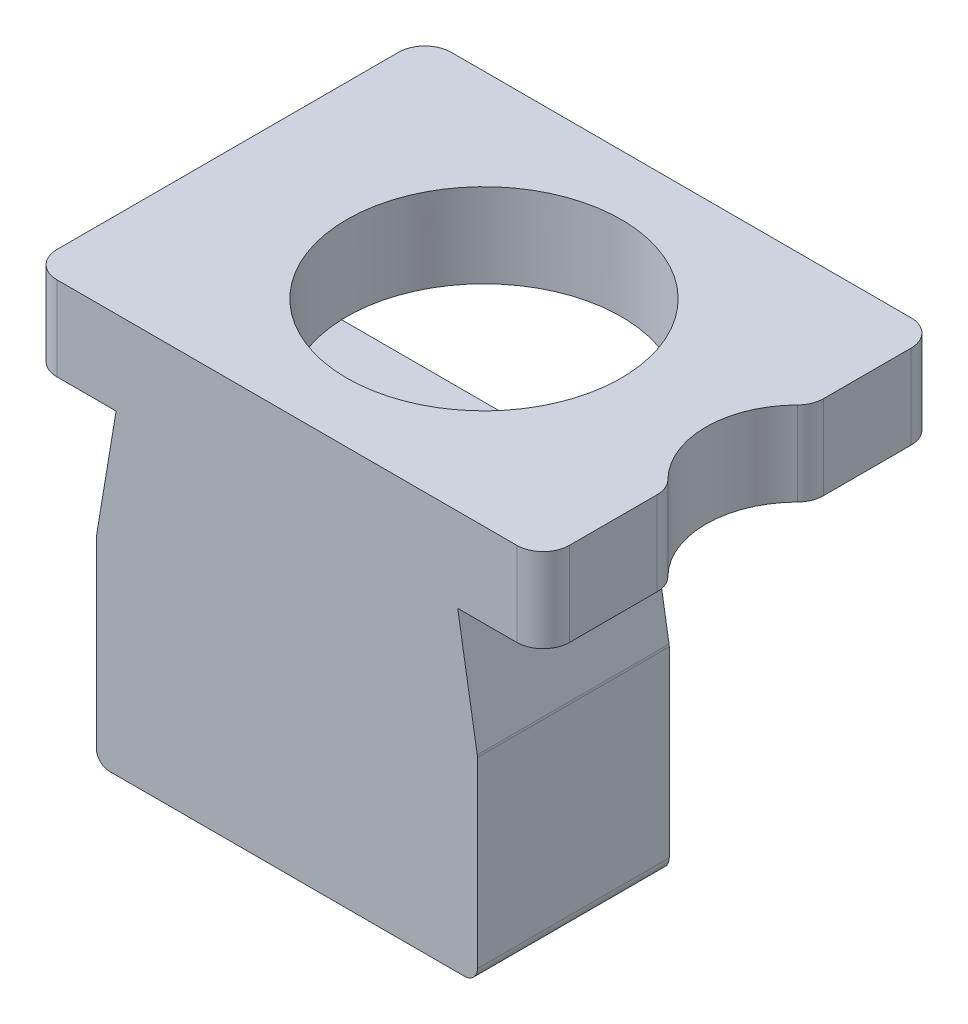
ISO-10303-21;
HEADER;
FILE_DESCRIPTION(('STEP AP214'),'2;1');
FILE_NAME('part.step','',(''),(''),'','','');
FILE_SCHEMA(('AUTOMOTIVE_DESIGN { 1 0 10303 214 1 1 1 1 }'));
ENDSEC;
DATA;
#1=APPLICATION_CONTEXT('core data for automotive mechanical design processes');
#2=APPLICATION_PROTOCOL_DEFINITION('international standard','automotive_design',2000,#1);
#3=PRODUCT_CONTEXT('',#1,'mechanical');
#4=PRODUCT('Part','Part','',(#3));
#5=PRODUCT_RELATED_PRODUCT_CATEGORY('part','',(#4));
#6=PRODUCT_DEFINITION_FORMATION('','',#4);
#7=PRODUCT_DEFINITION_CONTEXT('part definition',#1,'design');
#8=PRODUCT_DEFINITION('design','',#6,#7);
#9=PRODUCT_DEFINITION_SHAPE('','',#8);
#10=(LENGTH_UNIT() NAMED_UNIT(*) SI_UNIT(.MILLI.,.METRE.));
#11=(NAMED_UNIT(*) PLANE_ANGLE_UNIT() SI_UNIT($,.RADIAN.));
#12=(NAMED_UNIT(*) SI_UNIT($,.STERADIAN.) SOLID_ANGLE_UNIT());
#13=UNCERTAINTY_MEASURE_WITH_UNIT(LENGTH_MEASURE(1.E-05),#10,'distance_accuracy_value','');
#14=(GEOMETRIC_REPRESENTATION_CONTEXT(3) GLOBAL_UNCERTAINTY_ASSIGNED_CONTEXT((#13)) GLOBAL_UNIT_ASSIGNED_CONTEXT((#10,
#11,#12)) REPRESENTATION_CONTEXT('',''));
#15=CARTESIAN_POINT('',(0.,0.,0.));
#16=DIRECTION('',(0.,0.,1.));
#17=DIRECTION('',(1.,0.,0.));
#18=AXIS2_PLACEMENT_3D('',#15,#16,#17);
#19=CARTESIAN_POINT('',(19.5,6.4,15.));
#20=DIRECTION('',(-1.,0.,0.));
#21=DIRECTION('',(0.,0.,1.));
#22=AXIS2_PLACEMENT_3D('',#19,#20,#21);
#23=PLANE('',#22);
#24=DIRECTION('',(0.,0.,-1.));
#25=VECTOR('',#24,1.);
#26=CARTESIAN_POINT('',(19.5,0.,15.));
#27=LINE('',#26,#25);
#28=CARTESIAN_POINT('',(19.5,0.,13.));
#29=VERTEX_POINT('',#28);
#30=CARTESIAN_POINT('',(19.5,0.,6.33489795153023));
#31=VERTEX_POINT('',#30);
#32=EDGE_CURVE('E273',#29,#31,#27,.T.);
#33=ORIENTED_EDGE('',*,*,#32,.T.);
#34=DIRECTION('',(0.,1.,0.));
#35=VECTOR('',#34,1.);
#36=CARTESIAN_POINT('',(19.5,6.4,6.33489795153023));
#37=LINE('',#36,#35);
#38=CARTESIAN_POINT('',(19.5,6.4,6.33489795153023));
#39=VERTEX_POINT('',#38);
#40=EDGE_CURVE('E234',#31,#39,#37,.T.);
#41=ORIENTED_EDGE('',*,*,#40,.T.);
#42=DIRECTION('',(0.,0.,-1.));
#43=VECTOR('',#42,1.);
#44=CARTESIAN_POINT('',(19.5,6.4,15.));
#45=LINE('',#44,#43);
#46=CARTESIAN_POINT('',(19.5,6.4,13.));
#47=VERTEX_POINT('',#46);
#48=EDGE_CURVE('E264',#47,#39,#45,.T.);
#49=ORIENTED_EDGE('',*,*,#48,.F.);
#50=DIRECTION('',(0.,-1.,0.));
#51=VECTOR('',#50,1.);
#52=CARTESIAN_POINT('',(19.5,6.4,13.));
#53=LINE('',#52,#51);
#54=EDGE_CURVE('E229',#47,#29,#53,.T.);
#55=ORIENTED_EDGE('',*,*,#54,.T.);
#56=EDGE_LOOP('',(#33,#41,#49,#55));
#57=FACE_BOUND('',#56,.T.);
#58=ADVANCED_FACE('F43',(#57),#23,.F.);
#59=CARTESIAN_POINT('',(0.,6.4,0.));
#60=DIRECTION('',(0.,-1.,0.));
#61=DIRECTION('',(0.,0.,-1.));
#62=AXIS2_PLACEMENT_3D('',#59,#60,#61);
#63=PLANE('',#62);
#64=ORIENTED_EDGE('',*,*,#48,.T.);
#65=CARTESIAN_POINT('',(17.5,6.4,6.33489795153023));
#66=DIRECTION('',(0.,-1.,0.));
#67=DIRECTION('',(0.,0.,-1.));
#68=AXIS2_PLACEMENT_3D('',#65,#66,#67);
#69=CIRCLE('',#68,2.);
#70=CARTESIAN_POINT('',(18.9206426635388,6.4,4.92714285119018));
#71=VERTEX_POINT('',#70);
#72=EDGE_CURVE('E294',#39,#71,#69,.F.);
#73=ORIENTED_EDGE('',*,*,#72,.T.);
#74=CARTESIAN_POINT('',(23.8928919859245,6.4,0.));
#75=DIRECTION('',(0.,1.,0.));
#76=DIRECTION('',(0.,0.,1.));
#77=AXIS2_PLACEMENT_3D('',#74,#75,#76);
#78=CIRCLE('',#77,7.);
#79=CARTESIAN_POINT('',(18.9206426635388,6.4,-4.92714285119018));
#80=VERTEX_POINT('',#79);
#81=EDGE_CURVE('E436',#80,#71,#78,.T.);
#82=ORIENTED_EDGE('',*,*,#81,.F.);
#83=CARTESIAN_POINT('',(17.5,6.4,-6.33489795153023));
#84=DIRECTION('',(0.,-1.,0.));
#85=DIRECTION('',(0.,0.,-1.));
#86=AXIS2_PLACEMENT_3D('',#83,#84,#85);
#87=CIRCLE('',#86,2.);
#88=CARTESIAN_POINT('',(19.5,6.4,-6.33489795153022));
#89=VERTEX_POINT('',#88);
#90=EDGE_CURVE('E292',#80,#89,#87,.F.);
#91=ORIENTED_EDGE('',*,*,#90,.T.);
#92=CARTESIAN_POINT('',(19.5,6.4,-13.));
#93=VERTEX_POINT('',#92);
#94=EDGE_CURVE('E261',#89,#93,#45,.T.);
#95=ORIENTED_EDGE('',*,*,#94,.T.);
#96=CARTESIAN_POINT('',(17.5,6.4,-13.));
#97=DIRECTION('',(0.,-1.,0.));
#98=DIRECTION('',(0.,0.,-1.));
#99=AXIS2_PLACEMENT_3D('',#96,#97,#98);
#100=CIRCLE('',#99,2.);
#101=CARTESIAN_POINT('',(17.5,6.4,-15.));
#102=VERTEX_POINT('',#101);
#103=EDGE_CURVE('E284',#93,#102,#100,.F.);
#104=ORIENTED_EDGE('',*,*,#103,.T.);
#105=DIRECTION('',(-1.,0.,0.));
#106=VECTOR('',#105,1.);
#107=CARTESIAN_POINT('',(-19.5,6.4,-15.));
#108=LINE('',#107,#106);
#109=CARTESIAN_POINT('',(-17.5,6.4,-15.));
#110=VERTEX_POINT('',#109);
#111=EDGE_CURVE('E266',#102,#110,#108,.T.);
#112=ORIENTED_EDGE('',*,*,#111,.T.);
#113=CARTESIAN_POINT('',(-17.5,6.4,-13.));
#114=DIRECTION('',(0.,-1.,0.));
#115=DIRECTION('',(0.,0.,-1.));
#116=AXIS2_PLACEMENT_3D('',#113,#114,#115);
#117=CIRCLE('',#116,2.);
#118=CARTESIAN_POINT('',(-19.5,6.4,-13.));
#119=VERTEX_POINT('',#118);
#120=EDGE_CURVE('E290',#110,#119,#117,.F.);
#121=ORIENTED_EDGE('',*,*,#120,.T.);
#122=DIRECTION('',(0.,0.,1.));
#123=VECTOR('',#122,1.);
#124=CARTESIAN_POINT('',(-19.5,6.4,15.));
#125=LINE('',#124,#123);
#126=CARTESIAN_POINT('',(-19.5,6.4,13.));
#127=VERTEX_POINT('',#126);
#128=EDGE_CURVE('E237',#119,#127,#125,.T.);
#129=ORIENTED_EDGE('',*,*,#128,.T.);
#130=CARTESIAN_POINT('',(-17.5,6.4,13.));
#131=DIRECTION('',(0.,-1.,0.));
#132=DIRECTION('',(0.,0.,-1.));
#133=AXIS2_PLACEMENT_3D('',#130,#131,#132);
#134=CIRCLE('',#133,2.);
#135=CARTESIAN_POINT('',(-17.5,6.4,15.));
#136=VERTEX_POINT('',#135);
#137=EDGE_CURVE('E288',#127,#136,#134,.F.);
#138=ORIENTED_EDGE('',*,*,#137,.T.);
#139=DIRECTION('',(1.,0.,0.));
#140=VECTOR('',#139,1.);
#141=CARTESIAN_POINT('',(-19.5,6.4,15.));
#142=LINE('',#141,#140);
#143=CARTESIAN_POINT('',(17.5,6.4,15.));
#144=VERTEX_POINT('',#143);
#145=EDGE_CURVE('E230',#136,#144,#142,.T.);
#146=ORIENTED_EDGE('',*,*,#145,.T.);
#147=CARTESIAN_POINT('',(17.5,6.4,13.));
#148=DIRECTION('',(0.,-1.,0.));
#149=DIRECTION('',(0.,0.,-1.));
#150=AXIS2_PLACEMENT_3D('',#147,#148,#149);
#151=CIRCLE('',#150,2.);
#152=EDGE_CURVE('E286',#144,#47,#151,.F.);
#153=ORIENTED_EDGE('',*,*,#152,.T.);
#154=EDGE_LOOP('',(#64,#73,#82,#91,#95,#104,#112,#121,#129,#138,#146,#153));
#155=FACE_BOUND('',#154,.T.);
#156=CARTESIAN_POINT('',(0.,6.4,0.));
#157=DIRECTION('',(0.,1.,0.));
#158=DIRECTION('',(0.,0.,1.));
#159=AXIS2_PLACEMENT_3D('',#156,#157,#158);
#160=CIRCLE('',#159,10.45);
#161=CARTESIAN_POINT('',(0.,6.4,10.45));
#162=VERTEX_POINT('',#161);
#163=EDGE_CURVE('E256',#162,#162,#160,.T.);
#164=ORIENTED_EDGE('',*,*,#163,.F.);
#165=EDGE_LOOP('',(#164));
#166=FACE_BOUND('',#165,.T.);
#167=ADVANCED_FACE('F397',(#155,#166),#63,.F.);
#168=CARTESIAN_POINT('',(0.,0.,0.));
#169=DIRECTION('',(0.,-1.,0.));
#170=DIRECTION('',(0.,0.,-1.));
#171=AXIS2_PLACEMENT_3D('',#168,#169,#170);
#172=PLANE('',#171);
#173=CARTESIAN_POINT('',(23.8928919859245,0.,0.));
#174=DIRECTION('',(0.,-1.,0.));
#175=DIRECTION('',(0.,0.,-1.));
#176=AXIS2_PLACEMENT_3D('',#173,#174,#175);
#177=CIRCLE('',#176,7.);
#178=CARTESIAN_POINT('',(18.9206426635388,0.,-4.92714285119018));
#179=VERTEX_POINT('',#178);
#180=CARTESIAN_POINT('',(18.9206426635388,0.,4.92714285119018));
#181=VERTEX_POINT('',#180);
#182=EDGE_CURVE('E372',#179,#181,#177,.F.);
#183=ORIENTED_EDGE('',*,*,#182,.T.);
#184=CARTESIAN_POINT('',(17.5,0.,6.33489795153023));
#185=DIRECTION('',(0.,-1.,0.));
#186=DIRECTION('',(0.,0.,-1.));
#187=AXIS2_PLACEMENT_3D('',#184,#185,#186);
#188=CIRCLE('',#187,2.);
#189=EDGE_CURVE('E311',#181,#31,#188,.T.);
#190=ORIENTED_EDGE('',*,*,#189,.T.);
#191=ORIENTED_EDGE('',*,*,#32,.F.);
#192=CARTESIAN_POINT('',(17.5,0.,13.));
#193=DIRECTION('',(0.,-1.,0.));
#194=DIRECTION('',(0.,0.,-1.));
#195=AXIS2_PLACEMENT_3D('',#192,#193,#194);
#196=CIRCLE('',#195,2.);
#197=CARTESIAN_POINT('',(17.5,0.,15.));
#198=VERTEX_POINT('',#197);
#199=EDGE_CURVE('E303',#29,#198,#196,.T.);
#200=ORIENTED_EDGE('',*,*,#199,.T.);
#201=DIRECTION('',(1.,0.,0.));
#202=VECTOR('',#201,1.);
#203=CARTESIAN_POINT('',(-19.5,0.,15.));
#204=LINE('',#203,#202);
#205=CARTESIAN_POINT('',(13.,0.,15.));
#206=VERTEX_POINT('',#205);
#207=EDGE_CURVE('E280',#206,#198,#204,.T.);
#208=ORIENTED_EDGE('',*,*,#207,.F.);
#209=DIRECTION('',(0.,0.,1.));
#210=VECTOR('',#209,1.);
#211=CARTESIAN_POINT('',(13.,0.,0.399999999999996));
#212=LINE('',#211,#210);
#213=CARTESIAN_POINT('',(13.,0.,0.399999999999996));
#214=VERTEX_POINT('',#213);
#215=EDGE_CURVE('E210',#214,#206,#212,.T.);
#216=ORIENTED_EDGE('',*,*,#215,.F.);
#217=DIRECTION('',(-1.,0.,0.));
#218=VECTOR('',#217,1.);
#219=CARTESIAN_POINT('',(13.,0.,0.399999999999996));
#220=LINE('',#219,#218);
#221=CARTESIAN_POINT('',(10.4423416914024,0.,0.399999999999996));
#222=VERTEX_POINT('',#221);
#223=EDGE_CURVE('E221',#214,#222,#220,.T.);
#224=ORIENTED_EDGE('',*,*,#223,.T.);
#225=CARTESIAN_POINT('',(0.,0.,0.));
#226=DIRECTION('',(0.,1.,0.));
#227=DIRECTION('',(0.,0.,1.));
#228=AXIS2_PLACEMENT_3D('',#225,#226,#227);
#229=CIRCLE('',#228,10.45);
#230=CARTESIAN_POINT('',(-10.4423416914024,0.,0.399999999999996));
#231=VERTEX_POINT('',#230);
#232=EDGE_CURVE('E228',#222,#231,#229,.T.);
#233=ORIENTED_EDGE('',*,*,#232,.T.);
#234=CARTESIAN_POINT('',(-13.,0.,0.399999999999996));
#235=VERTEX_POINT('',#234);
#236=EDGE_CURVE('E216',#231,#235,#220,.T.);
#237=ORIENTED_EDGE('',*,*,#236,.T.);
#238=DIRECTION('',(0.,0.,1.));
#239=VECTOR('',#238,1.);
#240=CARTESIAN_POINT('',(-13.,0.,0.399999999999996));
#241=LINE('',#240,#239);
#242=CARTESIAN_POINT('',(-13.,0.,15.));
#243=VERTEX_POINT('',#242);
#244=EDGE_CURVE('E199',#235,#243,#241,.T.);
#245=ORIENTED_EDGE('',*,*,#244,.T.);
#246=CARTESIAN_POINT('',(-17.5,0.,15.));
#247=VERTEX_POINT('',#246);
#248=EDGE_CURVE('E265',#247,#243,#204,.T.);
#249=ORIENTED_EDGE('',*,*,#248,.F.);
#250=CARTESIAN_POINT('',(-17.5,0.,13.));
#251=DIRECTION('',(0.,-1.,0.));
#252=DIRECTION('',(0.,0.,-1.));
#253=AXIS2_PLACEMENT_3D('',#250,#251,#252);
#254=CIRCLE('',#253,2.);
#255=CARTESIAN_POINT('',(-19.5,0.,13.));
#256=VERTEX_POINT('',#255);
#257=EDGE_CURVE('E305',#247,#256,#254,.T.);
#258=ORIENTED_EDGE('',*,*,#257,.T.);
#259=DIRECTION('',(0.,0.,1.));
#260=VECTOR('',#259,1.);
#261=CARTESIAN_POINT('',(-19.5,0.,15.));
#262=LINE('',#261,#260);
#263=CARTESIAN_POINT('',(-19.5,0.,-13.));
#264=VERTEX_POINT('',#263);
#265=EDGE_CURVE('E277',#264,#256,#262,.T.);
#266=ORIENTED_EDGE('',*,*,#265,.F.);
#267=CARTESIAN_POINT('',(-17.5,0.,-13.));
#268=DIRECTION('',(0.,-1.,0.));
#269=DIRECTION('',(0.,0.,-1.));
#270=AXIS2_PLACEMENT_3D('',#267,#268,#269);
#271=CIRCLE('',#270,2.);
#272=CARTESIAN_POINT('',(-17.5,0.,-15.));
#273=VERTEX_POINT('',#272);
#274=EDGE_CURVE('E307',#264,#273,#271,.T.);
#275=ORIENTED_EDGE('',*,*,#274,.T.);
#276=DIRECTION('',(-1.,0.,0.));
#277=VECTOR('',#276,1.);
#278=CARTESIAN_POINT('',(-19.5,0.,-15.));
#279=LINE('',#278,#277);
#280=CARTESIAN_POINT('',(17.5,0.,-15.));
#281=VERTEX_POINT('',#280);
#282=EDGE_CURVE('E274',#281,#273,#279,.T.);
#283=ORIENTED_EDGE('',*,*,#282,.F.);
#284=CARTESIAN_POINT('',(17.5,0.,-13.));
#285=DIRECTION('',(0.,-1.,0.));
#286=DIRECTION('',(0.,0.,-1.));
#287=AXIS2_PLACEMENT_3D('',#284,#285,#286);
#288=CIRCLE('',#287,2.);
#289=CARTESIAN_POINT('',(19.5,0.,-13.));
#290=VERTEX_POINT('',#289);
#291=EDGE_CURVE('E301',#281,#290,#288,.T.);
#292=ORIENTED_EDGE('',*,*,#291,.T.);
#293=CARTESIAN_POINT('',(19.5,0.,-6.33489795153022));
#294=VERTEX_POINT('',#293);
#295=EDGE_CURVE('E259',#294,#290,#27,.T.);
#296=ORIENTED_EDGE('',*,*,#295,.F.);
#297=CARTESIAN_POINT('',(17.5,0.,-6.33489795153023));
#298=DIRECTION('',(0.,-1.,0.));
#299=DIRECTION('',(0.,0.,-1.));
#300=AXIS2_PLACEMENT_3D('',#297,#298,#299);
#301=CIRCLE('',#300,2.);
#302=EDGE_CURVE('E309',#294,#179,#301,.T.);
#303=ORIENTED_EDGE('',*,*,#302,.T.);
#304=EDGE_LOOP('',(#183,#190,#191,#200,#208,#216,#224,#233,#237,#245,#249,#258,#266,#275,#283,
#292,#296,#303));
#305=FACE_BOUND('',#304,.T.);
#306=ADVANCED_FACE('F225',(#305),#172,.T.);
#307=ORIENTED_EDGE('',*,*,#94,.F.);
#308=DIRECTION('',(0.,1.,0.));
#309=VECTOR('',#308,1.);
#310=CARTESIAN_POINT('',(19.5,6.4,-6.33489795153023));
#311=LINE('',#310,#309);
#312=EDGE_CURVE('E315',#89,#294,#311,.F.);
#313=ORIENTED_EDGE('',*,*,#312,.T.);
#314=ORIENTED_EDGE('',*,*,#295,.T.);
#315=DIRECTION('',(0.,-1.,0.));
#316=VECTOR('',#315,1.);
#317=CARTESIAN_POINT('',(19.5,6.4,-13.));
#318=LINE('',#317,#316);
#319=EDGE_CURVE('E313',#290,#93,#318,.F.);
#320=ORIENTED_EDGE('',*,*,#319,.T.);
#321=EDGE_LOOP('',(#307,#313,#314,#320));
#322=FACE_BOUND('',#321,.T.);
#323=ADVANCED_FACE('F400',(#322),#23,.F.);
#324=CARTESIAN_POINT('',(-19.5,6.4,-15.));
#325=DIRECTION('',(0.,0.,1.));
#326=DIRECTION('',(1.,0.,0.));
#327=AXIS2_PLACEMENT_3D('',#324,#325,#326);
#328=PLANE('',#327);
#329=ORIENTED_EDGE('',*,*,#282,.T.);
#330=DIRECTION('',(0.,-1.,0.));
#331=VECTOR('',#330,1.);
#332=CARTESIAN_POINT('',(-17.5,6.4,-15.));
#333=LINE('',#332,#331);
#334=EDGE_CURVE('E325',#273,#110,#333,.F.);
#335=ORIENTED_EDGE('',*,*,#334,.T.);
#336=ORIENTED_EDGE('',*,*,#111,.F.);
#337=DIRECTION('',(0.,-1.,0.));
#338=VECTOR('',#337,1.);
#339=CARTESIAN_POINT('',(17.5,6.4,-15.));
#340=LINE('',#339,#338);
#341=EDGE_CURVE('E322',#102,#281,#340,.T.);
#342=ORIENTED_EDGE('',*,*,#341,.T.);
#343=EDGE_LOOP('',(#329,#335,#336,#342));
#344=FACE_BOUND('',#343,.T.);
#345=ADVANCED_FACE('F411',(#344),#328,.F.);
#346=CARTESIAN_POINT('',(-19.5,6.4,15.));
#347=DIRECTION('',(1.,0.,0.));
#348=DIRECTION('',(0.,0.,-1.));
#349=AXIS2_PLACEMENT_3D('',#346,#347,#348);
#350=PLANE('',#349);
#351=ORIENTED_EDGE('',*,*,#128,.F.);
#352=DIRECTION('',(0.,-1.,0.));
#353=VECTOR('',#352,1.);
#354=CARTESIAN_POINT('',(-19.5,6.4,-13.));
#355=LINE('',#354,#353);
#356=EDGE_CURVE('E319',#119,#264,#355,.T.);
#357=ORIENTED_EDGE('',*,*,#356,.T.);
#358=ORIENTED_EDGE('',*,*,#265,.T.);
#359=DIRECTION('',(0.,-1.,0.));
#360=VECTOR('',#359,1.);
#361=CARTESIAN_POINT('',(-19.5,6.4,13.));
#362=LINE('',#361,#360);
#363=EDGE_CURVE('E317',#256,#127,#362,.F.);
#364=ORIENTED_EDGE('',*,*,#363,.T.);
#365=EDGE_LOOP('',(#351,#357,#358,#364));
#366=FACE_BOUND('',#365,.T.);
#367=ADVANCED_FACE('F417',(#366),#350,.F.);
#368=CARTESIAN_POINT('',(-19.5,6.4,15.));
#369=DIRECTION('',(0.,0.,-1.));
#370=DIRECTION('',(-1.,0.,0.));
#371=AXIS2_PLACEMENT_3D('',#368,#369,#370);
#372=PLANE('',#371);
#373=DIRECTION('',(-0.164398987305358,-0.986393923832144,0.));
#374=VECTOR('',#373,1.);
#375=CARTESIAN_POINT('',(-13.,0.,15.));
#376=LINE('',#375,#374);
#377=CARTESIAN_POINT('',(-14.4863939238321,-8.91836354299286,15.));
#378=VERTEX_POINT('',#377);
#379=EDGE_CURVE('E206',#243,#378,#376,.T.);
#380=ORIENTED_EDGE('',*,*,#379,.T.);
#381=CARTESIAN_POINT('',(-13.5,-9.08276253029821,15.));
#382=DIRECTION('',(0.,0.,-1.));
#383=DIRECTION('',(-1.,0.,0.));
#384=AXIS2_PLACEMENT_3D('',#381,#382,#383);
#385=CIRCLE('',#384,1.);
#386=CARTESIAN_POINT('',(-14.5,-9.08276253029821,15.));
#387=VERTEX_POINT('',#386);
#388=EDGE_CURVE('E340',#378,#387,#385,.F.);
#389=ORIENTED_EDGE('',*,*,#388,.T.);
#390=DIRECTION('',(0.,-1.,0.));
#391=VECTOR('',#390,1.);
#392=CARTESIAN_POINT('',(-14.5,-9.,15.));
#393=LINE('',#392,#391);
#394=CARTESIAN_POINT('',(-14.5,-23.,15.));
#395=VERTEX_POINT('',#394);
#396=EDGE_CURVE('E368',#387,#395,#393,.T.);
#397=ORIENTED_EDGE('',*,*,#396,.T.);
#398=CARTESIAN_POINT('',(-13.5,-23.,15.));
#399=DIRECTION('',(0.,0.,-1.));
#400=DIRECTION('',(-1.,0.,0.));
#401=AXIS2_PLACEMENT_3D('',#398,#399,#400);
#402=CIRCLE('',#401,1.);
#403=CARTESIAN_POINT('',(-13.5,-24.,15.));
#404=VERTEX_POINT('',#403);
#405=EDGE_CURVE('E336',#395,#404,#402,.F.);
#406=ORIENTED_EDGE('',*,*,#405,.T.);
#407=DIRECTION('',(1.,0.,0.));
#408=VECTOR('',#407,1.);
#409=CARTESIAN_POINT('',(-14.5,-24.,15.));
#410=LINE('',#409,#408);
#411=CARTESIAN_POINT('',(13.5,-24.,15.));
#412=VERTEX_POINT('',#411);
#413=EDGE_CURVE('E250',#404,#412,#410,.T.);
#414=ORIENTED_EDGE('',*,*,#413,.T.);
#415=CARTESIAN_POINT('',(13.5,-23.,15.));
#416=DIRECTION('',(0.,0.,-1.));
#417=DIRECTION('',(-1.,0.,0.));
#418=AXIS2_PLACEMENT_3D('',#415,#416,#417);
#419=CIRCLE('',#418,1.);
#420=CARTESIAN_POINT('',(14.5,-23.,15.));
#421=VERTEX_POINT('',#420);
#422=EDGE_CURVE('E334',#412,#421,#419,.F.);
#423=ORIENTED_EDGE('',*,*,#422,.T.);
#424=DIRECTION('',(0.,1.,0.));
#425=VECTOR('',#424,1.);
#426=CARTESIAN_POINT('',(14.5,-9.,15.));
#427=LINE('',#426,#425);
#428=CARTESIAN_POINT('',(14.5,-9.08276253029821,15.));
#429=VERTEX_POINT('',#428);
#430=EDGE_CURVE('E243',#421,#429,#427,.T.);
#431=ORIENTED_EDGE('',*,*,#430,.T.);
#432=CARTESIAN_POINT('',(13.5,-9.08276253029821,15.));
#433=DIRECTION('',(0.,0.,-1.));
#434=DIRECTION('',(-1.,0.,0.));
#435=AXIS2_PLACEMENT_3D('',#432,#433,#434);
#436=CIRCLE('',#435,1.);
#437=CARTESIAN_POINT('',(14.4863939238321,-8.91836354299286,15.));
#438=VERTEX_POINT('',#437);
#439=EDGE_CURVE('E338',#429,#438,#436,.F.);
#440=ORIENTED_EDGE('',*,*,#439,.T.);
#441=DIRECTION('',(-0.164398987305358,0.986393923832144,0.));
#442=VECTOR('',#441,1.);
#443=CARTESIAN_POINT('',(13.,0.,15.));
#444=LINE('',#443,#442);
#445=EDGE_CURVE('E240',#438,#206,#444,.T.);
#446=ORIENTED_EDGE('',*,*,#445,.T.);
#447=ORIENTED_EDGE('',*,*,#207,.T.);
#448=DIRECTION('',(0.,-1.,0.));
#449=VECTOR('',#448,1.);
#450=CARTESIAN_POINT('',(17.5,6.4,15.));
#451=LINE('',#450,#449);
#452=EDGE_CURVE('E327',#198,#144,#451,.F.);
#453=ORIENTED_EDGE('',*,*,#452,.T.);
#454=ORIENTED_EDGE('',*,*,#145,.F.);
#455=DIRECTION('',(0.,-1.,0.));
#456=VECTOR('',#455,1.);
#457=CARTESIAN_POINT('',(-17.5,6.4,15.));
#458=LINE('',#457,#456);
#459=EDGE_CURVE('E329',#136,#247,#458,.T.);
#460=ORIENTED_EDGE('',*,*,#459,.T.);
#461=ORIENTED_EDGE('',*,*,#248,.T.);
#462=EDGE_LOOP('',(#380,#389,#397,#406,#414,#423,#431,#440,#446,#447,#453,#454,#460,#461));
#463=FACE_BOUND('',#462,.T.);
#464=ADVANCED_FACE('F365',(#463),#372,.F.);
#465=CARTESIAN_POINT('',(0.,6.4,0.));
#466=DIRECTION('',(0.,-1.,0.));
#467=DIRECTION('',(0.,0.,-1.));
#468=AXIS2_PLACEMENT_3D('',#465,#466,#467);
#469=CYLINDRICAL_SURFACE('',#468,10.45);
#470=ORIENTED_EDGE('',*,*,#163,.T.);
#471=EDGE_LOOP('',(#470));
#472=FACE_BOUND('',#471,.T.);
#473=ORIENTED_EDGE('',*,*,#232,.F.);
#474=EDGE_CURVE('E254',#231,#222,#229,.T.);
#475=ORIENTED_EDGE('',*,*,#474,.F.);
#476=EDGE_LOOP('',(#473,#475));
#477=FACE_BOUND('',#476,.T.);
#478=ADVANCED_FACE('F514',(#472,#477),#469,.F.);
#479=CARTESIAN_POINT('',(13.,0.,0.399999999999996));
#480=DIRECTION('',(0.,1.,0.));
#481=DIRECTION('',(0.,0.,1.));
#482=AXIS2_PLACEMENT_3D('',#479,#480,#481);
#483=PLANE('',#482);
#484=EDGE_CURVE('E232',#222,#231,#220,.T.);
#485=ORIENTED_EDGE('',*,*,#484,.T.);
#486=ORIENTED_EDGE('',*,*,#474,.T.);
#487=EDGE_LOOP('',(#485,#486));
#488=FACE_BOUND('',#487,.T.);
#489=ADVANCED_FACE('F502',(#488),#483,.T.);
#490=CARTESIAN_POINT('',(13.,0.,0.399999999999996));
#491=DIRECTION('',(0.986393923832144,0.164398987305358,0.));
#492=DIRECTION('',(-0.164398987305358,0.986393923832144,0.));
#493=AXIS2_PLACEMENT_3D('',#490,#491,#492);
#494=PLANE('',#493);
#495=ORIENTED_EDGE('',*,*,#445,.F.);
#496=DIRECTION('',(0.,0.,1.));
#497=VECTOR('',#496,1.);
#498=CARTESIAN_POINT('',(14.4863939238321,-8.91836354299286,0.399999999999996));
#499=LINE('',#498,#497);
#500=CARTESIAN_POINT('',(14.4863939238321,-8.91836354299286,0.399999999999996));
#501=VERTEX_POINT('',#500);
#502=EDGE_CURVE('E358',#438,#501,#499,.F.);
#503=ORIENTED_EDGE('',*,*,#502,.T.);
#504=DIRECTION('',(-0.164398987305358,0.986393923832144,0.));
#505=VECTOR('',#504,1.);
#506=CARTESIAN_POINT('',(13.,0.,0.399999999999996));
#507=LINE('',#506,#505);
#508=EDGE_CURVE('E211',#501,#214,#507,.T.);
#509=ORIENTED_EDGE('',*,*,#508,.T.);
#510=ORIENTED_EDGE('',*,*,#215,.T.);
#511=EDGE_LOOP('',(#495,#503,#509,#510));
#512=FACE_BOUND('',#511,.T.);
#513=ADVANCED_FACE('F498',(#512),#494,.T.);
#514=CARTESIAN_POINT('',(14.5,-9.,0.399999999999996));
#515=DIRECTION('',(1.,0.,0.));
#516=DIRECTION('',(0.,1.,0.));
#517=AXIS2_PLACEMENT_3D('',#514,#515,#516);
#518=PLANE('',#517);
#519=DIRECTION('',(0.,1.,0.));
#520=VECTOR('',#519,1.);
#521=CARTESIAN_POINT('',(14.5,-9.,0.399999999999996));
#522=LINE('',#521,#520);
#523=CARTESIAN_POINT('',(14.5,-23.,0.399999999999996));
#524=VERTEX_POINT('',#523);
#525=CARTESIAN_POINT('',(14.5,-9.08276253029821,0.399999999999996));
#526=VERTEX_POINT('',#525);
#527=EDGE_CURVE('E374',#524,#526,#522,.T.);
#528=ORIENTED_EDGE('',*,*,#527,.T.);
#529=DIRECTION('',(0.,0.,1.));
#530=VECTOR('',#529,1.);
#531=CARTESIAN_POINT('',(14.5,-9.08276253029821,0.399999999999996));
#532=LINE('',#531,#530);
#533=EDGE_CURVE('E355',#526,#429,#532,.T.);
#534=ORIENTED_EDGE('',*,*,#533,.T.);
#535=ORIENTED_EDGE('',*,*,#430,.F.);
#536=DIRECTION('',(0.,0.,1.));
#537=VECTOR('',#536,1.);
#538=CARTESIAN_POINT('',(14.5,-23.,0.399999999999996));
#539=LINE('',#538,#537);
#540=EDGE_CURVE('E353',#421,#524,#539,.F.);
#541=ORIENTED_EDGE('',*,*,#540,.T.);
#542=EDGE_LOOP('',(#528,#534,#535,#541));
#543=FACE_BOUND('',#542,.T.);
#544=ADVANCED_FACE('F501',(#543),#518,.T.);
#545=CARTESIAN_POINT('',(-14.5,-24.,0.399999999999996));
#546=DIRECTION('',(0.,-1.,0.));
#547=DIRECTION('',(0.,0.,-1.));
#548=AXIS2_PLACEMENT_3D('',#545,#546,#547);
#549=PLANE('',#548);
#550=ORIENTED_EDGE('',*,*,#413,.F.);
#551=DIRECTION('',(0.,0.,1.));
#552=VECTOR('',#551,1.);
#553=CARTESIAN_POINT('',(-13.5,-24.,0.399999999999996));
#554=LINE('',#553,#552);
#555=CARTESIAN_POINT('',(-13.5,-24.,0.399999999999996));
#556=VERTEX_POINT('',#555);
#557=EDGE_CURVE('E11',#404,#556,#554,.F.);
#558=ORIENTED_EDGE('',*,*,#557,.T.);
#559=DIRECTION('',(1.,0.,0.));
#560=VECTOR('',#559,1.);
#561=CARTESIAN_POINT('',(-14.5,-24.,0.399999999999996));
#562=LINE('',#561,#560);
#563=CARTESIAN_POINT('',(13.5,-24.,0.399999999999996));
#564=VERTEX_POINT('',#563);
#565=EDGE_CURVE('E363',#556,#564,#562,.T.);
#566=ORIENTED_EDGE('',*,*,#565,.T.);
#567=DIRECTION('',(0.,0.,1.));
#568=VECTOR('',#567,1.);
#569=CARTESIAN_POINT('',(13.5,-24.,0.399999999999996));
#570=LINE('',#569,#568);
#571=EDGE_CURVE('E51',#564,#412,#570,.T.);
#572=ORIENTED_EDGE('',*,*,#571,.T.);
#573=EDGE_LOOP('',(#550,#558,#566,#572));
#574=FACE_BOUND('',#573,.T.);
#575=ADVANCED_FACE('F362',(#574),#549,.T.);
#576=CARTESIAN_POINT('',(-14.5,-9.,0.399999999999996));
#577=DIRECTION('',(-1.,0.,0.));
#578=DIRECTION('',(0.,-1.,0.));
#579=AXIS2_PLACEMENT_3D('',#576,#577,#578);
#580=PLANE('',#579);
#581=ORIENTED_EDGE('',*,*,#396,.F.);
#582=DIRECTION('',(0.,0.,1.));
#583=VECTOR('',#582,1.);
#584=CARTESIAN_POINT('',(-14.5,-9.08276253029821,0.399999999999996));
#585=LINE('',#584,#583);
#586=CARTESIAN_POINT('',(-14.5,-9.08276253029821,0.399999999999996));
#587=VERTEX_POINT('',#586);
#588=EDGE_CURVE('E345',#387,#587,#585,.F.);
#589=ORIENTED_EDGE('',*,*,#588,.T.);
#590=DIRECTION('',(0.,-1.,0.));
#591=VECTOR('',#590,1.);
#592=CARTESIAN_POINT('',(-14.5,-9.,0.399999999999996));
#593=LINE('',#592,#591);
#594=CARTESIAN_POINT('',(-14.5,-23.,0.399999999999996));
#595=VERTEX_POINT('',#594);
#596=EDGE_CURVE('E220',#587,#595,#593,.T.);
#597=ORIENTED_EDGE('',*,*,#596,.T.);
#598=DIRECTION('',(0.,0.,1.));
#599=VECTOR('',#598,1.);
#600=CARTESIAN_POINT('',(-14.5,-23.,0.399999999999996));
#601=LINE('',#600,#599);
#602=EDGE_CURVE('E342',#595,#395,#601,.T.);
#603=ORIENTED_EDGE('',*,*,#602,.T.);
#604=EDGE_LOOP('',(#581,#589,#597,#603));
#605=FACE_BOUND('',#604,.T.);
#606=ADVANCED_FACE('F382',(#605),#580,.T.);
#607=CARTESIAN_POINT('',(-13.,0.,0.399999999999996));
#608=DIRECTION('',(-0.986393923832144,0.164398987305358,0.));
#609=DIRECTION('',(-0.164398987305358,-0.986393923832144,0.));
#610=AXIS2_PLACEMENT_3D('',#607,#608,#609);
#611=PLANE('',#610);
#612=DIRECTION('',(-0.164398987305358,-0.986393923832144,0.));
#613=VECTOR('',#612,1.);
#614=CARTESIAN_POINT('',(-13.,0.,0.399999999999996));
#615=LINE('',#614,#613);
#616=CARTESIAN_POINT('',(-14.4863939238321,-8.91836354299286,0.399999999999996));
#617=VERTEX_POINT('',#616);
#618=EDGE_CURVE('E203',#235,#617,#615,.T.);
#619=ORIENTED_EDGE('',*,*,#618,.T.);
#620=DIRECTION('',(0.,0.,1.));
#621=VECTOR('',#620,1.);
#622=CARTESIAN_POINT('',(-14.4863939238321,-8.91836354299286,0.399999999999996));
#623=LINE('',#622,#621);
#624=EDGE_CURVE('E332',#617,#378,#623,.T.);
#625=ORIENTED_EDGE('',*,*,#624,.T.);
#626=ORIENTED_EDGE('',*,*,#379,.F.);
#627=ORIENTED_EDGE('',*,*,#244,.F.);
#628=EDGE_LOOP('',(#619,#625,#626,#627));
#629=FACE_BOUND('',#628,.T.);
#630=ADVANCED_FACE('F201',(#629),#611,.T.);
#631=CARTESIAN_POINT('',(0.,0.,0.399999999999996));
#632=DIRECTION('',(0.,0.,1.));
#633=DIRECTION('',(1.,0.,0.));
#634=AXIS2_PLACEMENT_3D('',#631,#632,#633);
#635=PLANE('',#634);
#636=ORIENTED_EDGE('',*,*,#596,.F.);
#637=CARTESIAN_POINT('',(-13.5,-9.08276253029821,0.399999999999996));
#638=DIRECTION('',(0.,0.,1.));
#639=DIRECTION('',(1.,0.,0.));
#640=AXIS2_PLACEMENT_3D('',#637,#638,#639);
#641=CIRCLE('',#640,1.);
#642=EDGE_CURVE('E219',#587,#617,#641,.F.);
#643=ORIENTED_EDGE('',*,*,#642,.T.);
#644=ORIENTED_EDGE('',*,*,#618,.F.);
#645=ORIENTED_EDGE('',*,*,#236,.F.);
#646=ORIENTED_EDGE('',*,*,#484,.F.);
#647=ORIENTED_EDGE('',*,*,#223,.F.);
#648=ORIENTED_EDGE('',*,*,#508,.F.);
#649=CARTESIAN_POINT('',(13.5,-9.08276253029821,0.399999999999996));
#650=DIRECTION('',(0.,0.,1.));
#651=DIRECTION('',(1.,0.,0.));
#652=AXIS2_PLACEMENT_3D('',#649,#650,#651);
#653=CIRCLE('',#652,1.);
#654=EDGE_CURVE('E350',#501,#526,#653,.F.);
#655=ORIENTED_EDGE('',*,*,#654,.T.);
#656=ORIENTED_EDGE('',*,*,#527,.F.);
#657=CARTESIAN_POINT('',(13.5,-23.,0.399999999999996));
#658=DIRECTION('',(0.,0.,1.));
#659=DIRECTION('',(1.,0.,0.));
#660=AXIS2_PLACEMENT_3D('',#657,#658,#659);
#661=CIRCLE('',#660,1.);
#662=EDGE_CURVE('E58',#524,#564,#661,.F.);
#663=ORIENTED_EDGE('',*,*,#662,.T.);
#664=ORIENTED_EDGE('',*,*,#565,.F.);
#665=CARTESIAN_POINT('',(-13.5,-23.,0.399999999999996));
#666=DIRECTION('',(0.,0.,1.));
#667=DIRECTION('',(1.,0.,0.));
#668=AXIS2_PLACEMENT_3D('',#665,#666,#667);
#669=CIRCLE('',#668,1.);
#670=EDGE_CURVE('E348',#556,#595,#669,.F.);
#671=ORIENTED_EDGE('',*,*,#670,.T.);
#672=EDGE_LOOP('',(#636,#643,#644,#645,#646,#647,#648,#655,#656,#663,#664,#671));
#673=FACE_BOUND('',#672,.T.);
#674=ADVANCED_FACE('F214',(#673),#635,.F.);
#675=CARTESIAN_POINT('',(23.8928919859245,-11.2074534215876,0.));
#676=DIRECTION('',(0.,1.,0.));
#677=DIRECTION('',(0.,0.,1.));
#678=AXIS2_PLACEMENT_3D('',#675,#676,#677);
#679=CYLINDRICAL_SURFACE('',#678,7.);
#680=ORIENTED_EDGE('',*,*,#81,.T.);
#681=DIRECTION('',(0.,1.,0.));
#682=VECTOR('',#681,1.);
#683=CARTESIAN_POINT('',(18.9206426635388,-11.2074534215876,4.92714285119018));
#684=LINE('',#683,#682);
#685=EDGE_CURVE('E299',#71,#181,#684,.F.);
#686=ORIENTED_EDGE('',*,*,#685,.T.);
#687=ORIENTED_EDGE('',*,*,#182,.F.);
#688=DIRECTION('',(0.,1.,0.));
#689=VECTOR('',#688,1.);
#690=CARTESIAN_POINT('',(18.9206426635388,-11.2074534215876,-4.92714285119018));
#691=LINE('',#690,#689);
#692=EDGE_CURVE('E296',#179,#80,#691,.T.);
#693=ORIENTED_EDGE('',*,*,#692,.T.);
#694=EDGE_LOOP('',(#680,#686,#687,#693));
#695=FACE_BOUND('',#694,.T.);
#696=ADVANCED_FACE('F433',(#695),#679,.F.);
#697=CARTESIAN_POINT('',(17.5,-11.2074534215876,6.33489795153023));
#698=DIRECTION('',(0.,1.,0.));
#699=DIRECTION('',(0.,0.,1.));
#700=AXIS2_PLACEMENT_3D('',#697,#698,#699);
#701=CYLINDRICAL_SURFACE('',#700,2.);
#702=ORIENTED_EDGE('',*,*,#189,.F.);
#703=ORIENTED_EDGE('',*,*,#685,.F.);
#704=ORIENTED_EDGE('',*,*,#72,.F.);
#705=ORIENTED_EDGE('',*,*,#40,.F.);
#706=EDGE_LOOP('',(#702,#703,#704,#705));
#707=FACE_BOUND('',#706,.T.);
#708=ADVANCED_FACE('F439',(#707),#701,.T.);
#709=CARTESIAN_POINT('',(17.5,-11.2074534215876,-6.33489795153023));
#710=DIRECTION('',(0.,1.,0.));
#711=DIRECTION('',(0.,0.,1.));
#712=AXIS2_PLACEMENT_3D('',#709,#710,#711);
#713=CYLINDRICAL_SURFACE('',#712,2.);
#714=ORIENTED_EDGE('',*,*,#302,.F.);
#715=ORIENTED_EDGE('',*,*,#312,.F.);
#716=ORIENTED_EDGE('',*,*,#90,.F.);
#717=ORIENTED_EDGE('',*,*,#692,.F.);
#718=EDGE_LOOP('',(#714,#715,#716,#717));
#719=FACE_BOUND('',#718,.T.);
#720=ADVANCED_FACE('F427',(#719),#713,.T.);
#721=CARTESIAN_POINT('',(-17.5,6.4,-13.));
#722=DIRECTION('',(0.,-1.,0.));
#723=DIRECTION('',(0.,0.,-1.));
#724=AXIS2_PLACEMENT_3D('',#721,#722,#723);
#725=CYLINDRICAL_SURFACE('',#724,2.);
#726=ORIENTED_EDGE('',*,*,#120,.F.);
#727=ORIENTED_EDGE('',*,*,#334,.F.);
#728=ORIENTED_EDGE('',*,*,#274,.F.);
#729=ORIENTED_EDGE('',*,*,#356,.F.);
#730=EDGE_LOOP('',(#726,#727,#728,#729));
#731=FACE_BOUND('',#730,.T.);
#732=ADVANCED_FACE('F464',(#731),#725,.T.);
#733=CARTESIAN_POINT('',(-17.5,6.4,13.));
#734=DIRECTION('',(0.,-1.,0.));
#735=DIRECTION('',(0.,0.,-1.));
#736=AXIS2_PLACEMENT_3D('',#733,#734,#735);
#737=CYLINDRICAL_SURFACE('',#736,2.);
#738=ORIENTED_EDGE('',*,*,#137,.F.);
#739=ORIENTED_EDGE('',*,*,#363,.F.);
#740=ORIENTED_EDGE('',*,*,#257,.F.);
#741=ORIENTED_EDGE('',*,*,#459,.F.);
#742=EDGE_LOOP('',(#738,#739,#740,#741));
#743=FACE_BOUND('',#742,.T.);
#744=ADVANCED_FACE('F458',(#743),#737,.T.);
#745=CARTESIAN_POINT('',(17.5,6.4,13.));
#746=DIRECTION('',(0.,-1.,0.));
#747=DIRECTION('',(0.,0.,-1.));
#748=AXIS2_PLACEMENT_3D('',#745,#746,#747);
#749=CYLINDRICAL_SURFACE('',#748,2.);
#750=ORIENTED_EDGE('',*,*,#152,.F.);
#751=ORIENTED_EDGE('',*,*,#452,.F.);
#752=ORIENTED_EDGE('',*,*,#199,.F.);
#753=ORIENTED_EDGE('',*,*,#54,.F.);
#754=EDGE_LOOP('',(#750,#751,#752,#753));
#755=FACE_BOUND('',#754,.T.);
#756=ADVANCED_FACE('F447',(#755),#749,.T.);
#757=CARTESIAN_POINT('',(17.5,6.4,-13.));
#758=DIRECTION('',(0.,-1.,0.));
#759=DIRECTION('',(0.,0.,-1.));
#760=AXIS2_PLACEMENT_3D('',#757,#758,#759);
#761=CYLINDRICAL_SURFACE('',#760,2.);
#762=ORIENTED_EDGE('',*,*,#103,.F.);
#763=ORIENTED_EDGE('',*,*,#319,.F.);
#764=ORIENTED_EDGE('',*,*,#291,.F.);
#765=ORIENTED_EDGE('',*,*,#341,.F.);
#766=EDGE_LOOP('',(#762,#763,#764,#765));
#767=FACE_BOUND('',#766,.T.);
#768=ADVANCED_FACE('F470',(#767),#761,.T.);
#769=CARTESIAN_POINT('',(-13.5,-9.08276253029821,0.399999999999996));
#770=DIRECTION('',(0.,0.,1.));
#771=DIRECTION('',(1.,0.,0.));
#772=AXIS2_PLACEMENT_3D('',#769,#770,#771);
#773=CYLINDRICAL_SURFACE('',#772,1.);
#774=ORIENTED_EDGE('',*,*,#642,.F.);
#775=ORIENTED_EDGE('',*,*,#588,.F.);
#776=ORIENTED_EDGE('',*,*,#388,.F.);
#777=ORIENTED_EDGE('',*,*,#624,.F.);
#778=EDGE_LOOP('',(#774,#775,#776,#777));
#779=FACE_BOUND('',#778,.T.);
#780=ADVANCED_FACE('F393',(#779),#773,.T.);
#781=CARTESIAN_POINT('',(13.5,-9.08276253029821,0.399999999999996));
#782=DIRECTION('',(0.,0.,1.));
#783=DIRECTION('',(1.,0.,0.));
#784=AXIS2_PLACEMENT_3D('',#781,#782,#783);
#785=CYLINDRICAL_SURFACE('',#784,1.);
#786=ORIENTED_EDGE('',*,*,#654,.F.);
#787=ORIENTED_EDGE('',*,*,#502,.F.);
#788=ORIENTED_EDGE('',*,*,#439,.F.);
#789=ORIENTED_EDGE('',*,*,#533,.F.);
#790=EDGE_LOOP('',(#786,#787,#788,#789));
#791=FACE_BOUND('',#790,.T.);
#792=ADVANCED_FACE('F388',(#791),#785,.T.);
#793=CARTESIAN_POINT('',(-13.5,-23.,0.399999999999996));
#794=DIRECTION('',(0.,0.,1.));
#795=DIRECTION('',(1.,0.,0.));
#796=AXIS2_PLACEMENT_3D('',#793,#794,#795);
#797=CYLINDRICAL_SURFACE('',#796,1.);
#798=ORIENTED_EDGE('',*,*,#670,.F.);
#799=ORIENTED_EDGE('',*,*,#557,.F.);
#800=ORIENTED_EDGE('',*,*,#405,.F.);
#801=ORIENTED_EDGE('',*,*,#602,.F.);
#802=EDGE_LOOP('',(#798,#799,#800,#801));
#803=FACE_BOUND('',#802,.T.);
#804=ADVANCED_FACE('F386',(#803),#797,.T.);
#805=CARTESIAN_POINT('',(13.5,-23.,0.399999999999996));
#806=DIRECTION('',(0.,0.,1.));
#807=DIRECTION('',(1.,0.,0.));
#808=AXIS2_PLACEMENT_3D('',#805,#806,#807);
#809=CYLINDRICAL_SURFACE('',#808,1.);
#810=ORIENTED_EDGE('',*,*,#662,.F.);
#811=ORIENTED_EDGE('',*,*,#540,.F.);
#812=ORIENTED_EDGE('',*,*,#422,.F.);
#813=ORIENTED_EDGE('',*,*,#571,.F.);
#814=EDGE_LOOP('',(#810,#811,#812,#813));
#815=FACE_BOUND('',#814,.T.);
#816=ADVANCED_FACE('F45',(#815),#809,.T.);
#817=CLOSED_SHELL('',(#58,#167,#306,#323,#345,#367,#464,#478,#489,#513,#544,#575,#606,#630,#674,
#696,#708,#720,#732,#744,#756,#768,#780,#792,#804,#816));
#818=MANIFOLD_SOLID_BREP('B2',#817);
#819=ADVANCED_BREP_SHAPE_REPRESENTATION('',(#18,#818),#14);
#820=SHAPE_DEFINITION_REPRESENTATION(#9,#819);
ENDSEC;
END-ISO-10303-21;
